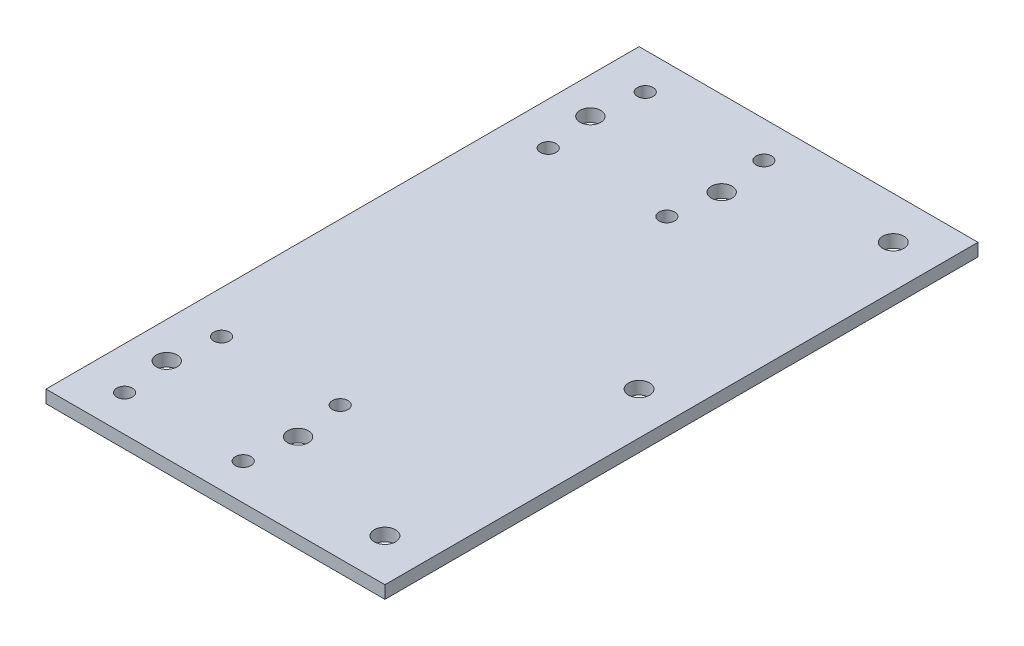
ISO-10303-21;
HEADER;
FILE_DESCRIPTION(('STEP AP214'),'2;1');
FILE_NAME('part.step','',(''),(''),'','','');
FILE_SCHEMA(('AUTOMOTIVE_DESIGN { 1 0 10303 214 1 1 1 1 }'));
ENDSEC;
DATA;
#1=APPLICATION_CONTEXT('core data for automotive mechanical design processes');
#2=APPLICATION_PROTOCOL_DEFINITION('international standard','automotive_design',2000,#1);
#3=PRODUCT_CONTEXT('',#1,'mechanical');
#4=PRODUCT('Part','Part','',(#3));
#5=PRODUCT_RELATED_PRODUCT_CATEGORY('part','',(#4));
#6=PRODUCT_DEFINITION_FORMATION('','',#4);
#7=PRODUCT_DEFINITION_CONTEXT('part definition',#1,'design');
#8=PRODUCT_DEFINITION('design','',#6,#7);
#9=PRODUCT_DEFINITION_SHAPE('','',#8);
#10=(LENGTH_UNIT() NAMED_UNIT(*) SI_UNIT(.MILLI.,.METRE.));
#11=(NAMED_UNIT(*) PLANE_ANGLE_UNIT() SI_UNIT($,.RADIAN.));
#12=(NAMED_UNIT(*) SI_UNIT($,.STERADIAN.) SOLID_ANGLE_UNIT());
#13=UNCERTAINTY_MEASURE_WITH_UNIT(LENGTH_MEASURE(1.E-05),#10,'distance_accuracy_value','');
#14=(GEOMETRIC_REPRESENTATION_CONTEXT(3) GLOBAL_UNCERTAINTY_ASSIGNED_CONTEXT((#13)) GLOBAL_UNIT_ASSIGNED_CONTEXT((#10,
#11,#12)) REPRESENTATION_CONTEXT('',''));
#15=CARTESIAN_POINT('',(0.,0.,0.));
#16=DIRECTION('',(0.,0.,1.));
#17=DIRECTION('',(1.,0.,0.));
#18=AXIS2_PLACEMENT_3D('',#15,#16,#17);
#19=CARTESIAN_POINT('',(40.,3.,0.));
#20=DIRECTION('',(-1.,0.,0.));
#21=DIRECTION('',(0.,0.,1.));
#22=AXIS2_PLACEMENT_3D('',#19,#20,#21);
#23=PLANE('',#22);
#24=DIRECTION('',(0.,0.,-1.));
#25=VECTOR('',#24,1.);
#26=CARTESIAN_POINT('',(40.,0.,0.));
#27=LINE('',#26,#25);
#28=CARTESIAN_POINT('',(40.,0.,70.));
#29=VERTEX_POINT('',#28);
#30=CARTESIAN_POINT('',(40.,0.,-70.));
#31=VERTEX_POINT('',#30);
#32=EDGE_CURVE('E176',#29,#31,#27,.T.);
#33=ORIENTED_EDGE('',*,*,#32,.T.);
#34=DIRECTION('',(0.,-1.,0.));
#35=VECTOR('',#34,1.);
#36=CARTESIAN_POINT('',(40.,3.,-70.));
#37=LINE('',#36,#35);
#38=CARTESIAN_POINT('',(40.,3.,-70.));
#39=VERTEX_POINT('',#38);
#40=EDGE_CURVE('E11',#39,#31,#37,.T.);
#41=ORIENTED_EDGE('',*,*,#40,.F.);
#42=DIRECTION('',(0.,0.,-1.));
#43=VECTOR('',#42,1.);
#44=CARTESIAN_POINT('',(40.,3.,0.));
#45=LINE('',#44,#43);
#46=CARTESIAN_POINT('',(40.,3.,70.));
#47=VERTEX_POINT('',#46);
#48=EDGE_CURVE('E88',#47,#39,#45,.T.);
#49=ORIENTED_EDGE('',*,*,#48,.F.);
#50=DIRECTION('',(0.,-1.,0.));
#51=VECTOR('',#50,1.);
#52=CARTESIAN_POINT('',(40.,3.,70.));
#53=LINE('',#52,#51);
#54=EDGE_CURVE('E159',#47,#29,#53,.T.);
#55=ORIENTED_EDGE('',*,*,#54,.T.);
#56=EDGE_LOOP('',(#33,#41,#49,#55));
#57=FACE_BOUND('',#56,.T.);
#58=ADVANCED_FACE('F47',(#57),#23,.F.);
#59=CARTESIAN_POINT('',(0.,3.,-70.));
#60=DIRECTION('',(0.,0.,-1.));
#61=DIRECTION('',(-1.,0.,0.));
#62=AXIS2_PLACEMENT_3D('',#59,#60,#61);
#63=PLANE('',#62);
#64=DIRECTION('',(1.,0.,0.));
#65=VECTOR('',#64,1.);
#66=CARTESIAN_POINT('',(0.,0.,-70.));
#67=LINE('',#66,#65);
#68=CARTESIAN_POINT('',(-40.,0.,-70.));
#69=VERTEX_POINT('',#68);
#70=EDGE_CURVE('E97',#69,#31,#67,.T.);
#71=ORIENTED_EDGE('',*,*,#70,.F.);
#72=DIRECTION('',(0.,-1.,0.));
#73=VECTOR('',#72,1.);
#74=CARTESIAN_POINT('',(-40.,3.,-70.));
#75=LINE('',#74,#73);
#76=CARTESIAN_POINT('',(-40.,3.,-70.));
#77=VERTEX_POINT('',#76);
#78=EDGE_CURVE('E57',#77,#69,#75,.T.);
#79=ORIENTED_EDGE('',*,*,#78,.F.);
#80=DIRECTION('',(1.,0.,0.));
#81=VECTOR('',#80,1.);
#82=CARTESIAN_POINT('',(0.,3.,-70.));
#83=LINE('',#82,#81);
#84=EDGE_CURVE('E95',#77,#39,#83,.T.);
#85=ORIENTED_EDGE('',*,*,#84,.T.);
#86=ORIENTED_EDGE('',*,*,#40,.T.);
#87=EDGE_LOOP('',(#71,#79,#85,#86));
#88=FACE_BOUND('',#87,.T.);
#89=ADVANCED_FACE('F94',(#88),#63,.T.);
#90=CARTESIAN_POINT('',(-40.,3.,0.));
#91=DIRECTION('',(-1.,0.,0.));
#92=DIRECTION('',(0.,0.,1.));
#93=AXIS2_PLACEMENT_3D('',#90,#91,#92);
#94=PLANE('',#93);
#95=DIRECTION('',(0.,0.,-1.));
#96=VECTOR('',#95,1.);
#97=CARTESIAN_POINT('',(-40.,0.,0.));
#98=LINE('',#97,#96);
#99=CARTESIAN_POINT('',(-40.,0.,70.));
#100=VERTEX_POINT('',#99);
#101=EDGE_CURVE('E182',#100,#69,#98,.T.);
#102=ORIENTED_EDGE('',*,*,#101,.F.);
#103=DIRECTION('',(0.,-1.,0.));
#104=VECTOR('',#103,1.);
#105=CARTESIAN_POINT('',(-40.,3.,70.));
#106=LINE('',#105,#104);
#107=CARTESIAN_POINT('',(-40.,3.,70.));
#108=VERTEX_POINT('',#107);
#109=EDGE_CURVE('E80',#108,#100,#106,.T.);
#110=ORIENTED_EDGE('',*,*,#109,.F.);
#111=DIRECTION('',(0.,0.,-1.));
#112=VECTOR('',#111,1.);
#113=CARTESIAN_POINT('',(-40.,3.,0.));
#114=LINE('',#113,#112);
#115=EDGE_CURVE('E105',#108,#77,#114,.T.);
#116=ORIENTED_EDGE('',*,*,#115,.T.);
#117=ORIENTED_EDGE('',*,*,#78,.T.);
#118=EDGE_LOOP('',(#102,#110,#116,#117));
#119=FACE_BOUND('',#118,.T.);
#120=ADVANCED_FACE('F108',(#119),#94,.T.);
#121=CARTESIAN_POINT('',(-0.499999999999992,3.,-50.));
#122=DIRECTION('',(0.,-1.,0.));
#123=DIRECTION('',(0.,0.,-1.));
#124=AXIS2_PLACEMENT_3D('',#121,#122,#123);
#125=CYLINDRICAL_SURFACE('',#124,2.45);
#126=CARTESIAN_POINT('',(-0.499999999999992,3.,-50.));
#127=DIRECTION('',(0.,1.,0.));
#128=DIRECTION('',(0.,0.,1.));
#129=AXIS2_PLACEMENT_3D('',#126,#127,#128);
#130=CIRCLE('',#129,2.45);
#131=CARTESIAN_POINT('',(-0.499999999999992,3.,-47.55));
#132=VERTEX_POINT('',#131);
#133=EDGE_CURVE('E151',#132,#132,#130,.T.);
#134=ORIENTED_EDGE('',*,*,#133,.T.);
#135=EDGE_LOOP('',(#134));
#136=FACE_BOUND('',#135,.T.);
#137=CARTESIAN_POINT('',(-0.499999999999992,0.,-50.));
#138=DIRECTION('',(0.,1.,0.));
#139=DIRECTION('',(0.,0.,1.));
#140=AXIS2_PLACEMENT_3D('',#137,#138,#139);
#141=CIRCLE('',#140,2.45);
#142=CARTESIAN_POINT('',(-0.499999999999992,0.,-47.55));
#143=VERTEX_POINT('',#142);
#144=EDGE_CURVE('E223',#143,#143,#141,.T.);
#145=ORIENTED_EDGE('',*,*,#144,.F.);
#146=EDGE_LOOP('',(#145));
#147=FACE_BOUND('',#146,.T.);
#148=ADVANCED_FACE('F480',(#136,#147),#125,.F.);
#149=CARTESIAN_POINT('',(-2.00000000000001,3.,-61.45));
#150=DIRECTION('',(0.,-1.,0.));
#151=DIRECTION('',(0.,0.,-1.));
#152=AXIS2_PLACEMENT_3D('',#149,#150,#151);
#153=CYLINDRICAL_SURFACE('',#152,1.85);
#154=CARTESIAN_POINT('',(-2.00000000000001,3.,-61.45));
#155=DIRECTION('',(0.,1.,0.));
#156=DIRECTION('',(0.,0.,1.));
#157=AXIS2_PLACEMENT_3D('',#154,#155,#156);
#158=CIRCLE('',#157,1.85);
#159=CARTESIAN_POINT('',(-2.00000000000001,3.,-59.6));
#160=VERTEX_POINT('',#159);
#161=EDGE_CURVE('E147',#160,#160,#158,.F.);
#162=ORIENTED_EDGE('',*,*,#161,.F.);
#163=EDGE_LOOP('',(#162));
#164=FACE_BOUND('',#163,.T.);
#165=CARTESIAN_POINT('',(-2.00000000000001,0.,-61.45));
#166=DIRECTION('',(0.,1.,0.));
#167=DIRECTION('',(0.,0.,1.));
#168=AXIS2_PLACEMENT_3D('',#165,#166,#167);
#169=CIRCLE('',#168,1.85);
#170=CARTESIAN_POINT('',(-2.00000000000001,0.,-59.6));
#171=VERTEX_POINT('',#170);
#172=EDGE_CURVE('E219',#171,#171,#169,.F.);
#173=ORIENTED_EDGE('',*,*,#172,.T.);
#174=EDGE_LOOP('',(#173));
#175=FACE_BOUND('',#174,.T.);
#176=ADVANCED_FACE('F471',(#164,#175),#153,.F.);
#177=CARTESIAN_POINT('',(-2.00000000000001,3.,-38.55));
#178=DIRECTION('',(0.,-1.,0.));
#179=DIRECTION('',(0.,0.,-1.));
#180=AXIS2_PLACEMENT_3D('',#177,#178,#179);
#181=CYLINDRICAL_SURFACE('',#180,1.85);
#182=CARTESIAN_POINT('',(-2.00000000000001,3.,-38.55));
#183=DIRECTION('',(0.,1.,0.));
#184=DIRECTION('',(0.,0.,1.));
#185=AXIS2_PLACEMENT_3D('',#182,#183,#184);
#186=CIRCLE('',#185,1.85);
#187=CARTESIAN_POINT('',(-2.00000000000001,3.,-36.7));
#188=VERTEX_POINT('',#187);
#189=EDGE_CURVE('E143',#188,#188,#186,.T.);
#190=ORIENTED_EDGE('',*,*,#189,.T.);
#191=EDGE_LOOP('',(#190));
#192=FACE_BOUND('',#191,.T.);
#193=CARTESIAN_POINT('',(-2.00000000000001,0.,-38.55));
#194=DIRECTION('',(0.,1.,0.));
#195=DIRECTION('',(0.,0.,1.));
#196=AXIS2_PLACEMENT_3D('',#193,#194,#195);
#197=CIRCLE('',#196,1.85);
#198=CARTESIAN_POINT('',(-2.00000000000001,0.,-36.7));
#199=VERTEX_POINT('',#198);
#200=EDGE_CURVE('E215',#199,#199,#197,.T.);
#201=ORIENTED_EDGE('',*,*,#200,.F.);
#202=EDGE_LOOP('',(#201));
#203=FACE_BOUND('',#202,.T.);
#204=ADVANCED_FACE('F462',(#192,#203),#181,.F.);
#205=CARTESIAN_POINT('',(-30.,3.,-38.55));
#206=DIRECTION('',(0.,-1.,0.));
#207=DIRECTION('',(0.,0.,-1.));
#208=AXIS2_PLACEMENT_3D('',#205,#206,#207);
#209=CYLINDRICAL_SURFACE('',#208,1.85);
#210=CARTESIAN_POINT('',(-30.,3.,-38.55));
#211=DIRECTION('',(0.,1.,0.));
#212=DIRECTION('',(0.,0.,1.));
#213=AXIS2_PLACEMENT_3D('',#210,#211,#212);
#214=CIRCLE('',#213,1.85);
#215=CARTESIAN_POINT('',(-30.,3.,-36.7));
#216=VERTEX_POINT('',#215);
#217=EDGE_CURVE('E139',#216,#216,#214,.F.);
#218=ORIENTED_EDGE('',*,*,#217,.F.);
#219=EDGE_LOOP('',(#218));
#220=FACE_BOUND('',#219,.T.);
#221=CARTESIAN_POINT('',(-30.,0.,-38.55));
#222=DIRECTION('',(0.,1.,0.));
#223=DIRECTION('',(0.,0.,1.));
#224=AXIS2_PLACEMENT_3D('',#221,#222,#223);
#225=CIRCLE('',#224,1.85);
#226=CARTESIAN_POINT('',(-30.,0.,-36.7));
#227=VERTEX_POINT('',#226);
#228=EDGE_CURVE('E211',#227,#227,#225,.F.);
#229=ORIENTED_EDGE('',*,*,#228,.T.);
#230=EDGE_LOOP('',(#229));
#231=FACE_BOUND('',#230,.T.);
#232=ADVANCED_FACE('F453',(#220,#231),#209,.F.);
#233=CARTESIAN_POINT('',(-30.,3.,61.4500000000001));
#234=DIRECTION('',(0.,-1.,0.));
#235=DIRECTION('',(0.,0.,-1.));
#236=AXIS2_PLACEMENT_3D('',#233,#234,#235);
#237=CYLINDRICAL_SURFACE('',#236,1.85);
#238=CARTESIAN_POINT('',(-30.,3.,61.4500000000001));
#239=DIRECTION('',(0.,1.,0.));
#240=DIRECTION('',(0.,0.,1.));
#241=AXIS2_PLACEMENT_3D('',#238,#239,#240);
#242=CIRCLE('',#241,1.85);
#243=CARTESIAN_POINT('',(-30.,3.,63.3000000000001));
#244=VERTEX_POINT('',#243);
#245=EDGE_CURVE('E135',#244,#244,#242,.F.);
#246=ORIENTED_EDGE('',*,*,#245,.F.);
#247=EDGE_LOOP('',(#246));
#248=FACE_BOUND('',#247,.T.);
#249=CARTESIAN_POINT('',(-30.,0.,61.4500000000001));
#250=DIRECTION('',(0.,1.,0.));
#251=DIRECTION('',(0.,0.,1.));
#252=AXIS2_PLACEMENT_3D('',#249,#250,#251);
#253=CIRCLE('',#252,1.85);
#254=CARTESIAN_POINT('',(-30.,0.,63.3000000000001));
#255=VERTEX_POINT('',#254);
#256=EDGE_CURVE('E207',#255,#255,#253,.F.);
#257=ORIENTED_EDGE('',*,*,#256,.T.);
#258=EDGE_LOOP('',(#257));
#259=FACE_BOUND('',#258,.T.);
#260=ADVANCED_FACE('F444',(#248,#259),#237,.F.);
#261=CARTESIAN_POINT('',(-31.5,3.,50.));
#262=DIRECTION('',(0.,-1.,0.));
#263=DIRECTION('',(0.,0.,-1.));
#264=AXIS2_PLACEMENT_3D('',#261,#262,#263);
#265=CYLINDRICAL_SURFACE('',#264,2.45);
#266=CARTESIAN_POINT('',(-31.5,3.,50.));
#267=DIRECTION('',(0.,1.,0.));
#268=DIRECTION('',(0.,0.,1.));
#269=AXIS2_PLACEMENT_3D('',#266,#267,#268);
#270=CIRCLE('',#269,2.45);
#271=CARTESIAN_POINT('',(-31.5,3.,52.4500000000001));
#272=VERTEX_POINT('',#271);
#273=EDGE_CURVE('E131',#272,#272,#270,.T.);
#274=ORIENTED_EDGE('',*,*,#273,.T.);
#275=EDGE_LOOP('',(#274));
#276=FACE_BOUND('',#275,.T.);
#277=CARTESIAN_POINT('',(-31.5,0.,50.));
#278=DIRECTION('',(0.,1.,0.));
#279=DIRECTION('',(0.,0.,1.));
#280=AXIS2_PLACEMENT_3D('',#277,#278,#279);
#281=CIRCLE('',#280,2.45);
#282=CARTESIAN_POINT('',(-31.5,0.,52.4500000000001));
#283=VERTEX_POINT('',#282);
#284=EDGE_CURVE('E203',#283,#283,#281,.T.);
#285=ORIENTED_EDGE('',*,*,#284,.F.);
#286=EDGE_LOOP('',(#285));
#287=FACE_BOUND('',#286,.T.);
#288=ADVANCED_FACE('F435',(#276,#287),#265,.F.);
#289=CARTESIAN_POINT('',(-30.,3.,38.55));
#290=DIRECTION('',(0.,-1.,0.));
#291=DIRECTION('',(0.,0.,-1.));
#292=AXIS2_PLACEMENT_3D('',#289,#290,#291);
#293=CYLINDRICAL_SURFACE('',#292,1.85);
#294=CARTESIAN_POINT('',(-30.,3.,38.55));
#295=DIRECTION('',(0.,1.,0.));
#296=DIRECTION('',(0.,0.,1.));
#297=AXIS2_PLACEMENT_3D('',#294,#295,#296);
#298=CIRCLE('',#297,1.85);
#299=CARTESIAN_POINT('',(-30.,3.,40.4));
#300=VERTEX_POINT('',#299);
#301=EDGE_CURVE('E127',#300,#300,#298,.T.);
#302=ORIENTED_EDGE('',*,*,#301,.T.);
#303=EDGE_LOOP('',(#302));
#304=FACE_BOUND('',#303,.T.);
#305=CARTESIAN_POINT('',(-30.,0.,38.55));
#306=DIRECTION('',(0.,1.,0.));
#307=DIRECTION('',(0.,0.,1.));
#308=AXIS2_PLACEMENT_3D('',#305,#306,#307);
#309=CIRCLE('',#308,1.85);
#310=CARTESIAN_POINT('',(-30.,0.,40.4));
#311=VERTEX_POINT('',#310);
#312=EDGE_CURVE('E199',#311,#311,#309,.T.);
#313=ORIENTED_EDGE('',*,*,#312,.F.);
#314=EDGE_LOOP('',(#313));
#315=FACE_BOUND('',#314,.T.);
#316=ADVANCED_FACE('F426',(#304,#315),#293,.F.);
#317=CARTESIAN_POINT('',(-2.00000000000001,3.,61.4500000000001));
#318=DIRECTION('',(0.,-1.,0.));
#319=DIRECTION('',(0.,0.,-1.));
#320=AXIS2_PLACEMENT_3D('',#317,#318,#319);
#321=CYLINDRICAL_SURFACE('',#320,1.85);
#322=CARTESIAN_POINT('',(-2.00000000000001,3.,61.4500000000001));
#323=DIRECTION('',(0.,1.,0.));
#324=DIRECTION('',(0.,0.,1.));
#325=AXIS2_PLACEMENT_3D('',#322,#323,#324);
#326=CIRCLE('',#325,1.85);
#327=CARTESIAN_POINT('',(-2.00000000000001,3.,63.3000000000001));
#328=VERTEX_POINT('',#327);
#329=EDGE_CURVE('E123',#328,#328,#326,.T.);
#330=ORIENTED_EDGE('',*,*,#329,.T.);
#331=EDGE_LOOP('',(#330));
#332=FACE_BOUND('',#331,.T.);
#333=CARTESIAN_POINT('',(-2.00000000000001,0.,61.4500000000001));
#334=DIRECTION('',(0.,1.,0.));
#335=DIRECTION('',(0.,0.,1.));
#336=AXIS2_PLACEMENT_3D('',#333,#334,#335);
#337=CIRCLE('',#336,1.85);
#338=CARTESIAN_POINT('',(-2.00000000000001,0.,63.3000000000001));
#339=VERTEX_POINT('',#338);
#340=EDGE_CURVE('E195',#339,#339,#337,.T.);
#341=ORIENTED_EDGE('',*,*,#340,.F.);
#342=EDGE_LOOP('',(#341));
#343=FACE_BOUND('',#342,.T.);
#344=ADVANCED_FACE('F417',(#332,#343),#321,.F.);
#345=CARTESIAN_POINT('',(-2.00000000000001,3.,38.55));
#346=DIRECTION('',(0.,-1.,0.));
#347=DIRECTION('',(0.,0.,-1.));
#348=AXIS2_PLACEMENT_3D('',#345,#346,#347);
#349=CYLINDRICAL_SURFACE('',#348,1.85);
#350=CARTESIAN_POINT('',(-2.00000000000001,3.,38.55));
#351=DIRECTION('',(0.,1.,0.));
#352=DIRECTION('',(0.,0.,1.));
#353=AXIS2_PLACEMENT_3D('',#350,#351,#352);
#354=CIRCLE('',#353,1.85);
#355=CARTESIAN_POINT('',(-2.00000000000001,3.,40.4));
#356=VERTEX_POINT('',#355);
#357=EDGE_CURVE('E119',#356,#356,#354,.F.);
#358=ORIENTED_EDGE('',*,*,#357,.F.);
#359=EDGE_LOOP('',(#358));
#360=FACE_BOUND('',#359,.T.);
#361=CARTESIAN_POINT('',(-2.00000000000001,0.,38.55));
#362=DIRECTION('',(0.,1.,0.));
#363=DIRECTION('',(0.,0.,1.));
#364=AXIS2_PLACEMENT_3D('',#361,#362,#363);
#365=CIRCLE('',#364,1.85);
#366=CARTESIAN_POINT('',(-2.00000000000001,0.,40.4));
#367=VERTEX_POINT('',#366);
#368=EDGE_CURVE('E191',#367,#367,#365,.F.);
#369=ORIENTED_EDGE('',*,*,#368,.T.);
#370=EDGE_LOOP('',(#369));
#371=FACE_BOUND('',#370,.T.);
#372=ADVANCED_FACE('F408',(#360,#371),#349,.F.);
#373=CARTESIAN_POINT('',(-0.499999999999992,3.,50.));
#374=DIRECTION('',(0.,-1.,0.));
#375=DIRECTION('',(0.,0.,-1.));
#376=AXIS2_PLACEMENT_3D('',#373,#374,#375);
#377=CYLINDRICAL_SURFACE('',#376,2.45);
#378=CARTESIAN_POINT('',(-0.499999999999992,3.,50.));
#379=DIRECTION('',(0.,1.,0.));
#380=DIRECTION('',(0.,0.,1.));
#381=AXIS2_PLACEMENT_3D('',#378,#379,#380);
#382=CIRCLE('',#381,2.45);
#383=CARTESIAN_POINT('',(-0.499999999999992,3.,52.4500000000001));
#384=VERTEX_POINT('',#383);
#385=EDGE_CURVE('E112',#384,#384,#382,.F.);
#386=ORIENTED_EDGE('',*,*,#385,.F.);
#387=EDGE_LOOP('',(#386));
#388=FACE_BOUND('',#387,.T.);
#389=CARTESIAN_POINT('',(-0.499999999999992,0.,50.));
#390=DIRECTION('',(0.,1.,0.));
#391=DIRECTION('',(0.,0.,1.));
#392=AXIS2_PLACEMENT_3D('',#389,#390,#391);
#393=CIRCLE('',#392,2.45);
#394=CARTESIAN_POINT('',(-0.499999999999992,0.,52.4500000000001));
#395=VERTEX_POINT('',#394);
#396=EDGE_CURVE('E187',#395,#395,#393,.F.);
#397=ORIENTED_EDGE('',*,*,#396,.T.);
#398=EDGE_LOOP('',(#397));
#399=FACE_BOUND('',#398,.T.);
#400=ADVANCED_FACE('F400',(#388,#399),#377,.F.);
#401=CARTESIAN_POINT('',(0.,3.,70.));
#402=DIRECTION('',(0.,0.,-1.));
#403=DIRECTION('',(-1.,0.,0.));
#404=AXIS2_PLACEMENT_3D('',#401,#402,#403);
#405=PLANE('',#404);
#406=DIRECTION('',(1.,0.,0.));
#407=VECTOR('',#406,1.);
#408=CARTESIAN_POINT('',(0.,0.,70.));
#409=LINE('',#408,#407);
#410=EDGE_CURVE('E83',#100,#29,#409,.T.);
#411=ORIENTED_EDGE('',*,*,#410,.T.);
#412=ORIENTED_EDGE('',*,*,#54,.F.);
#413=DIRECTION('',(1.,0.,0.));
#414=VECTOR('',#413,1.);
#415=CARTESIAN_POINT('',(0.,3.,70.));
#416=LINE('',#415,#414);
#417=EDGE_CURVE('E65',#108,#47,#416,.T.);
#418=ORIENTED_EDGE('',*,*,#417,.F.);
#419=ORIENTED_EDGE('',*,*,#109,.T.);
#420=EDGE_LOOP('',(#411,#412,#418,#419));
#421=FACE_BOUND('',#420,.T.);
#422=ADVANCED_FACE('F291',(#421),#405,.F.);
#423=CARTESIAN_POINT('',(30.0000000000006,3.,0.));
#424=DIRECTION('',(0.,-1.,0.));
#425=DIRECTION('',(0.,0.,-1.));
#426=AXIS2_PLACEMENT_3D('',#423,#424,#425);
#427=CYLINDRICAL_SURFACE('',#426,2.5);
#428=CARTESIAN_POINT('',(30.0000000000006,3.,0.));
#429=DIRECTION('',(0.,1.,0.));
#430=DIRECTION('',(0.,0.,1.));
#431=AXIS2_PLACEMENT_3D('',#428,#429,#430);
#432=CIRCLE('',#431,2.5);
#433=CARTESIAN_POINT('',(30.0000000000006,3.,2.49999999999999));
#434=VERTEX_POINT('',#433);
#435=EDGE_CURVE('E318',#434,#434,#432,.T.);
#436=ORIENTED_EDGE('',*,*,#435,.T.);
#437=EDGE_LOOP('',(#436));
#438=FACE_BOUND('',#437,.T.);
#439=CARTESIAN_POINT('',(30.0000000000006,0.,0.));
#440=DIRECTION('',(0.,1.,0.));
#441=DIRECTION('',(0.,0.,1.));
#442=AXIS2_PLACEMENT_3D('',#439,#440,#441);
#443=CIRCLE('',#442,2.5);
#444=CARTESIAN_POINT('',(30.0000000000006,0.,2.49999999999999));
#445=VERTEX_POINT('',#444);
#446=EDGE_CURVE('E172',#445,#445,#443,.T.);
#447=ORIENTED_EDGE('',*,*,#446,.F.);
#448=EDGE_LOOP('',(#447));
#449=FACE_BOUND('',#448,.T.);
#450=ADVANCED_FACE('F287',(#438,#449),#427,.F.);
#451=CARTESIAN_POINT('',(30.0000000000012,3.,60.));
#452=DIRECTION('',(0.,-1.,0.));
#453=DIRECTION('',(0.,0.,-1.));
#454=AXIS2_PLACEMENT_3D('',#451,#452,#453);
#455=CYLINDRICAL_SURFACE('',#454,2.5);
#456=CARTESIAN_POINT('',(30.0000000000012,3.,60.));
#457=DIRECTION('',(0.,1.,0.));
#458=DIRECTION('',(0.,0.,1.));
#459=AXIS2_PLACEMENT_3D('',#456,#457,#458);
#460=CIRCLE('',#459,2.5);
#461=CARTESIAN_POINT('',(30.0000000000012,3.,62.5));
#462=VERTEX_POINT('',#461);
#463=EDGE_CURVE('E313',#462,#462,#460,.T.);
#464=ORIENTED_EDGE('',*,*,#463,.T.);
#465=EDGE_LOOP('',(#464));
#466=FACE_BOUND('',#465,.T.);
#467=CARTESIAN_POINT('',(30.0000000000012,0.,60.));
#468=DIRECTION('',(0.,1.,0.));
#469=DIRECTION('',(0.,0.,1.));
#470=AXIS2_PLACEMENT_3D('',#467,#468,#469);
#471=CIRCLE('',#470,2.5);
#472=CARTESIAN_POINT('',(30.0000000000012,0.,62.5));
#473=VERTEX_POINT('',#472);
#474=EDGE_CURVE('E168',#473,#473,#471,.T.);
#475=ORIENTED_EDGE('',*,*,#474,.F.);
#476=EDGE_LOOP('',(#475));
#477=FACE_BOUND('',#476,.T.);
#478=ADVANCED_FACE('F290',(#466,#477),#455,.F.);
#479=CARTESIAN_POINT('',(30.,3.,-60.));
#480=DIRECTION('',(0.,-1.,0.));
#481=DIRECTION('',(0.,0.,-1.));
#482=AXIS2_PLACEMENT_3D('',#479,#480,#481);
#483=CYLINDRICAL_SURFACE('',#482,2.5);
#484=CARTESIAN_POINT('',(30.,3.,-60.));
#485=DIRECTION('',(0.,1.,0.));
#486=DIRECTION('',(0.,0.,1.));
#487=AXIS2_PLACEMENT_3D('',#484,#485,#486);
#488=CIRCLE('',#487,2.5);
#489=CARTESIAN_POINT('',(30.,3.,-57.5));
#490=VERTEX_POINT('',#489);
#491=EDGE_CURVE('E302',#490,#490,#488,.T.);
#492=ORIENTED_EDGE('',*,*,#491,.T.);
#493=EDGE_LOOP('',(#492));
#494=FACE_BOUND('',#493,.T.);
#495=CARTESIAN_POINT('',(30.,0.,-60.));
#496=DIRECTION('',(0.,1.,0.));
#497=DIRECTION('',(0.,0.,1.));
#498=AXIS2_PLACEMENT_3D('',#495,#496,#497);
#499=CIRCLE('',#498,2.5);
#500=CARTESIAN_POINT('',(30.,0.,-57.5));
#501=VERTEX_POINT('',#500);
#502=EDGE_CURVE('E164',#501,#501,#499,.T.);
#503=ORIENTED_EDGE('',*,*,#502,.F.);
#504=EDGE_LOOP('',(#503));
#505=FACE_BOUND('',#504,.T.);
#506=ADVANCED_FACE('F275',(#494,#505),#483,.F.);
#507=CARTESIAN_POINT('',(-30.,3.,-61.45));
#508=DIRECTION('',(0.,-1.,0.));
#509=DIRECTION('',(0.,0.,-1.));
#510=AXIS2_PLACEMENT_3D('',#507,#508,#509);
#511=CYLINDRICAL_SURFACE('',#510,1.85);
#512=CARTESIAN_POINT('',(-30.,3.,-61.45));
#513=DIRECTION('',(0.,1.,0.));
#514=DIRECTION('',(0.,0.,1.));
#515=AXIS2_PLACEMENT_3D('',#512,#513,#514);
#516=CIRCLE('',#515,1.85);
#517=CARTESIAN_POINT('',(-30.,3.,-59.6));
#518=VERTEX_POINT('',#517);
#519=EDGE_CURVE('E231',#518,#518,#516,.T.);
#520=ORIENTED_EDGE('',*,*,#519,.T.);
#521=EDGE_LOOP('',(#520));
#522=FACE_BOUND('',#521,.T.);
#523=CARTESIAN_POINT('',(-30.,0.,-61.45));
#524=DIRECTION('',(0.,1.,0.));
#525=DIRECTION('',(0.,0.,1.));
#526=AXIS2_PLACEMENT_3D('',#523,#524,#525);
#527=CIRCLE('',#526,1.85);
#528=CARTESIAN_POINT('',(-30.,0.,-59.6));
#529=VERTEX_POINT('',#528);
#530=EDGE_CURVE('E160',#529,#529,#527,.T.);
#531=ORIENTED_EDGE('',*,*,#530,.F.);
#532=EDGE_LOOP('',(#531));
#533=FACE_BOUND('',#532,.T.);
#534=ADVANCED_FACE('F49',(#522,#533),#511,.F.);
#535=CARTESIAN_POINT('',(-31.5,3.,-50.));
#536=DIRECTION('',(0.,-1.,0.));
#537=DIRECTION('',(0.,0.,-1.));
#538=AXIS2_PLACEMENT_3D('',#535,#536,#537);
#539=CYLINDRICAL_SURFACE('',#538,2.45);
#540=CARTESIAN_POINT('',(-31.5,3.,-50.));
#541=DIRECTION('',(0.,1.,0.));
#542=DIRECTION('',(0.,0.,1.));
#543=AXIS2_PLACEMENT_3D('',#540,#541,#542);
#544=CIRCLE('',#543,2.45);
#545=CARTESIAN_POINT('',(-31.5,3.,-47.55));
#546=VERTEX_POINT('',#545);
#547=EDGE_CURVE('E155',#546,#546,#544,.F.);
#548=ORIENTED_EDGE('',*,*,#547,.F.);
#549=EDGE_LOOP('',(#548));
#550=FACE_BOUND('',#549,.T.);
#551=CARTESIAN_POINT('',(-31.5,0.,-50.));
#552=DIRECTION('',(0.,1.,0.));
#553=DIRECTION('',(0.,0.,1.));
#554=AXIS2_PLACEMENT_3D('',#551,#552,#553);
#555=CIRCLE('',#554,2.45);
#556=CARTESIAN_POINT('',(-31.5,0.,-47.55));
#557=VERTEX_POINT('',#556);
#558=EDGE_CURVE('E227',#557,#557,#555,.F.);
#559=ORIENTED_EDGE('',*,*,#558,.T.);
#560=EDGE_LOOP('',(#559));
#561=FACE_BOUND('',#560,.T.);
#562=ADVANCED_FACE('F265',(#550,#561),#539,.F.);
#563=CARTESIAN_POINT('',(0.,3.,0.));
#564=DIRECTION('',(0.,1.,0.));
#565=DIRECTION('',(0.,0.,1.));
#566=AXIS2_PLACEMENT_3D('',#563,#564,#565);
#567=PLANE('',#566);
#568=ORIENTED_EDGE('',*,*,#519,.F.);
#569=EDGE_LOOP('',(#568));
#570=FACE_BOUND('',#569,.T.);
#571=ORIENTED_EDGE('',*,*,#491,.F.);
#572=EDGE_LOOP('',(#571));
#573=FACE_BOUND('',#572,.T.);
#574=ORIENTED_EDGE('',*,*,#463,.F.);
#575=EDGE_LOOP('',(#574));
#576=FACE_BOUND('',#575,.T.);
#577=ORIENTED_EDGE('',*,*,#435,.F.);
#578=EDGE_LOOP('',(#577));
#579=FACE_BOUND('',#578,.T.);
#580=ORIENTED_EDGE('',*,*,#48,.T.);
#581=ORIENTED_EDGE('',*,*,#84,.F.);
#582=ORIENTED_EDGE('',*,*,#115,.F.);
#583=ORIENTED_EDGE('',*,*,#417,.T.);
#584=EDGE_LOOP('',(#580,#581,#582,#583));
#585=FACE_BOUND('',#584,.T.);
#586=ORIENTED_EDGE('',*,*,#385,.T.);
#587=EDGE_LOOP('',(#586));
#588=FACE_BOUND('',#587,.T.);
#589=ORIENTED_EDGE('',*,*,#357,.T.);
#590=EDGE_LOOP('',(#589));
#591=FACE_BOUND('',#590,.T.);
#592=ORIENTED_EDGE('',*,*,#329,.F.);
#593=EDGE_LOOP('',(#592));
#594=FACE_BOUND('',#593,.T.);
#595=ORIENTED_EDGE('',*,*,#301,.F.);
#596=EDGE_LOOP('',(#595));
#597=FACE_BOUND('',#596,.T.);
#598=ORIENTED_EDGE('',*,*,#273,.F.);
#599=EDGE_LOOP('',(#598));
#600=FACE_BOUND('',#599,.T.);
#601=ORIENTED_EDGE('',*,*,#245,.T.);
#602=EDGE_LOOP('',(#601));
#603=FACE_BOUND('',#602,.T.);
#604=ORIENTED_EDGE('',*,*,#217,.T.);
#605=EDGE_LOOP('',(#604));
#606=FACE_BOUND('',#605,.T.);
#607=ORIENTED_EDGE('',*,*,#189,.F.);
#608=EDGE_LOOP('',(#607));
#609=FACE_BOUND('',#608,.T.);
#610=ORIENTED_EDGE('',*,*,#161,.T.);
#611=EDGE_LOOP('',(#610));
#612=FACE_BOUND('',#611,.T.);
#613=ORIENTED_EDGE('',*,*,#133,.F.);
#614=EDGE_LOOP('',(#613));
#615=FACE_BOUND('',#614,.T.);
#616=ORIENTED_EDGE('',*,*,#547,.T.);
#617=EDGE_LOOP('',(#616));
#618=FACE_BOUND('',#617,.T.);
#619=ADVANCED_FACE('F103',(#570,#573,#576,#579,#585,#588,#591,#594,#597,#600,#603,#606,#609,
#612,#615,#618),#567,.T.);
#620=CARTESIAN_POINT('',(0.,0.,0.));
#621=DIRECTION('',(0.,1.,0.));
#622=DIRECTION('',(0.,0.,1.));
#623=AXIS2_PLACEMENT_3D('',#620,#621,#622);
#624=PLANE('',#623);
#625=ORIENTED_EDGE('',*,*,#530,.T.);
#626=EDGE_LOOP('',(#625));
#627=FACE_BOUND('',#626,.T.);
#628=ORIENTED_EDGE('',*,*,#502,.T.);
#629=EDGE_LOOP('',(#628));
#630=FACE_BOUND('',#629,.T.);
#631=ORIENTED_EDGE('',*,*,#474,.T.);
#632=EDGE_LOOP('',(#631));
#633=FACE_BOUND('',#632,.T.);
#634=ORIENTED_EDGE('',*,*,#446,.T.);
#635=EDGE_LOOP('',(#634));
#636=FACE_BOUND('',#635,.T.);
#637=ORIENTED_EDGE('',*,*,#32,.F.);
#638=ORIENTED_EDGE('',*,*,#410,.F.);
#639=ORIENTED_EDGE('',*,*,#101,.T.);
#640=ORIENTED_EDGE('',*,*,#70,.T.);
#641=EDGE_LOOP('',(#637,#638,#639,#640));
#642=FACE_BOUND('',#641,.T.);
#643=ORIENTED_EDGE('',*,*,#396,.F.);
#644=EDGE_LOOP('',(#643));
#645=FACE_BOUND('',#644,.T.);
#646=ORIENTED_EDGE('',*,*,#368,.F.);
#647=EDGE_LOOP('',(#646));
#648=FACE_BOUND('',#647,.T.);
#649=ORIENTED_EDGE('',*,*,#340,.T.);
#650=EDGE_LOOP('',(#649));
#651=FACE_BOUND('',#650,.T.);
#652=ORIENTED_EDGE('',*,*,#312,.T.);
#653=EDGE_LOOP('',(#652));
#654=FACE_BOUND('',#653,.T.);
#655=ORIENTED_EDGE('',*,*,#284,.T.);
#656=EDGE_LOOP('',(#655));
#657=FACE_BOUND('',#656,.T.);
#658=ORIENTED_EDGE('',*,*,#256,.F.);
#659=EDGE_LOOP('',(#658));
#660=FACE_BOUND('',#659,.T.);
#661=ORIENTED_EDGE('',*,*,#228,.F.);
#662=EDGE_LOOP('',(#661));
#663=FACE_BOUND('',#662,.T.);
#664=ORIENTED_EDGE('',*,*,#200,.T.);
#665=EDGE_LOOP('',(#664));
#666=FACE_BOUND('',#665,.T.);
#667=ORIENTED_EDGE('',*,*,#172,.F.);
#668=EDGE_LOOP('',(#667));
#669=FACE_BOUND('',#668,.T.);
#670=ORIENTED_EDGE('',*,*,#144,.T.);
#671=EDGE_LOOP('',(#670));
#672=FACE_BOUND('',#671,.T.);
#673=ORIENTED_EDGE('',*,*,#558,.F.);
#674=EDGE_LOOP('',(#673));
#675=FACE_BOUND('',#674,.T.);
#676=ADVANCED_FACE('F238',(#627,#630,#633,#636,#642,#645,#648,#651,#654,#657,#660,#663,#666,
#669,#672,#675),#624,.F.);
#677=CLOSED_SHELL('',(#58,#89,#120,#148,#176,#204,#232,#260,#288,#316,#344,#372,#400,#422,#450,
#478,#506,#534,#562,#619,#676));
#678=MANIFOLD_SOLID_BREP('B2',#677);
#679=ADVANCED_BREP_SHAPE_REPRESENTATION('',(#18,#678),#14);
#680=SHAPE_DEFINITION_REPRESENTATION(#9,#679);
ENDSEC;
END-ISO-10303-21;
